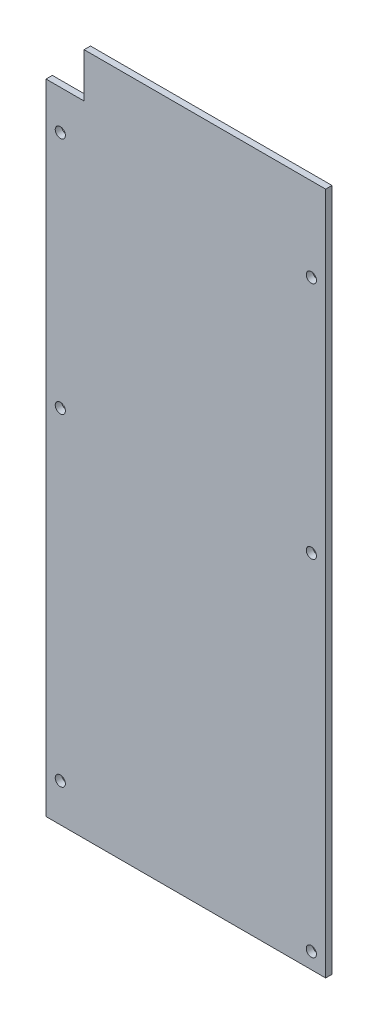
ISO-10303-21;
HEADER;
FILE_DESCRIPTION(('STEP AP214'),'2;1');
FILE_NAME('part.step','',(''),(''),'','','');
FILE_SCHEMA(('AUTOMOTIVE_DESIGN { 1 0 10303 214 1 1 1 1 }'));
ENDSEC;
DATA;
#1=APPLICATION_CONTEXT('core data for automotive mechanical design processes');
#2=APPLICATION_PROTOCOL_DEFINITION('international standard','automotive_design',2000,#1);
#3=PRODUCT_CONTEXT('',#1,'mechanical');
#4=PRODUCT('Part','Part','',(#3));
#5=PRODUCT_RELATED_PRODUCT_CATEGORY('part','',(#4));
#6=PRODUCT_DEFINITION_FORMATION('','',#4);
#7=PRODUCT_DEFINITION_CONTEXT('part definition',#1,'design');
#8=PRODUCT_DEFINITION('design','',#6,#7);
#9=PRODUCT_DEFINITION_SHAPE('','',#8);
#10=(LENGTH_UNIT() NAMED_UNIT(*) SI_UNIT(.MILLI.,.METRE.));
#11=(NAMED_UNIT(*) PLANE_ANGLE_UNIT() SI_UNIT($,.RADIAN.));
#12=(NAMED_UNIT(*) SI_UNIT($,.STERADIAN.) SOLID_ANGLE_UNIT());
#13=UNCERTAINTY_MEASURE_WITH_UNIT(LENGTH_MEASURE(1.E-05),#10,'distance_accuracy_value','');
#14=(GEOMETRIC_REPRESENTATION_CONTEXT(3) GLOBAL_UNCERTAINTY_ASSIGNED_CONTEXT((#13)) GLOBAL_UNIT_ASSIGNED_CONTEXT((#10,
#11,#12)) REPRESENTATION_CONTEXT('',''));
#15=CARTESIAN_POINT('',(0.,0.,0.));
#16=DIRECTION('',(0.,0.,1.));
#17=DIRECTION('',(1.,0.,0.));
#18=AXIS2_PLACEMENT_3D('',#15,#16,#17);
#19=CARTESIAN_POINT('',(0.,215.,2.));
#20=DIRECTION('',(0.,1.,0.));
#21=DIRECTION('',(0.,0.,1.));
#22=AXIS2_PLACEMENT_3D('',#19,#20,#21);
#23=PLANE('',#22);
#24=DIRECTION('',(1.,0.,0.));
#25=VECTOR('',#24,1.);
#26=CARTESIAN_POINT('',(0.,215.,0.));
#27=LINE('',#26,#25);
#28=CARTESIAN_POINT('',(12.,215.,0.));
#29=VERTEX_POINT('',#28);
#30=CARTESIAN_POINT('',(88.,215.,0.));
#31=VERTEX_POINT('',#30);
#32=EDGE_CURVE('E141',#29,#31,#27,.T.);
#33=ORIENTED_EDGE('',*,*,#32,.F.);
#34=DIRECTION('',(0.,0.,-1.));
#35=VECTOR('',#34,1.);
#36=CARTESIAN_POINT('',(12.,215.,2.));
#37=LINE('',#36,#35);
#38=CARTESIAN_POINT('',(12.,215.,2.));
#39=VERTEX_POINT('',#38);
#40=EDGE_CURVE('E11',#39,#29,#37,.T.);
#41=ORIENTED_EDGE('',*,*,#40,.F.);
#42=DIRECTION('',(1.,0.,0.));
#43=VECTOR('',#42,1.);
#44=CARTESIAN_POINT('',(0.,215.,2.));
#45=LINE('',#44,#43);
#46=CARTESIAN_POINT('',(88.,215.,2.));
#47=VERTEX_POINT('',#46);
#48=EDGE_CURVE('E240',#39,#47,#45,.T.);
#49=ORIENTED_EDGE('',*,*,#48,.T.);
#50=DIRECTION('',(0.,0.,-1.));
#51=VECTOR('',#50,1.);
#52=CARTESIAN_POINT('',(88.,215.,2.));
#53=LINE('',#52,#51);
#54=EDGE_CURVE('E82',#47,#31,#53,.T.);
#55=ORIENTED_EDGE('',*,*,#54,.T.);
#56=EDGE_LOOP('',(#33,#41,#49,#55));
#57=FACE_BOUND('',#56,.T.);
#58=ADVANCED_FACE('F36',(#57),#23,.T.);
#59=CARTESIAN_POINT('',(12.0000000000001,0.,2.));
#60=DIRECTION('',(1.,0.,0.));
#61=DIRECTION('',(0.,1.,0.));
#62=AXIS2_PLACEMENT_3D('',#59,#60,#61);
#63=PLANE('',#62);
#64=DIRECTION('',(0.,-1.,0.));
#65=VECTOR('',#64,1.);
#66=CARTESIAN_POINT('',(12.0000000000001,0.,0.));
#67=LINE('',#66,#65);
#68=CARTESIAN_POINT('',(12.,201.,0.));
#69=VERTEX_POINT('',#68);
#70=EDGE_CURVE('E143',#29,#69,#67,.T.);
#71=ORIENTED_EDGE('',*,*,#70,.T.);
#72=DIRECTION('',(0.,0.,-1.));
#73=VECTOR('',#72,1.);
#74=CARTESIAN_POINT('',(12.,201.,2.));
#75=LINE('',#74,#73);
#76=CARTESIAN_POINT('',(12.,201.,2.));
#77=VERTEX_POINT('',#76);
#78=EDGE_CURVE('E45',#77,#69,#75,.T.);
#79=ORIENTED_EDGE('',*,*,#78,.F.);
#80=DIRECTION('',(0.,-1.,0.));
#81=VECTOR('',#80,1.);
#82=CARTESIAN_POINT('',(12.0000000000001,0.,2.));
#83=LINE('',#82,#81);
#84=EDGE_CURVE('E118',#39,#77,#83,.T.);
#85=ORIENTED_EDGE('',*,*,#84,.F.);
#86=ORIENTED_EDGE('',*,*,#40,.T.);
#87=EDGE_LOOP('',(#71,#79,#85,#86));
#88=FACE_BOUND('',#87,.T.);
#89=ADVANCED_FACE('F165',(#88),#63,.F.);
#90=CARTESIAN_POINT('',(0.,201.,2.));
#91=DIRECTION('',(0.,1.,0.));
#92=DIRECTION('',(0.,0.,1.));
#93=AXIS2_PLACEMENT_3D('',#90,#91,#92);
#94=PLANE('',#93);
#95=DIRECTION('',(1.,0.,0.));
#96=VECTOR('',#95,1.);
#97=CARTESIAN_POINT('',(0.,201.,0.));
#98=LINE('',#97,#96);
#99=CARTESIAN_POINT('',(0.,201.,0.));
#100=VERTEX_POINT('',#99);
#101=EDGE_CURVE('E146',#100,#69,#98,.T.);
#102=ORIENTED_EDGE('',*,*,#101,.F.);
#103=DIRECTION('',(0.,0.,-1.));
#104=VECTOR('',#103,1.);
#105=CARTESIAN_POINT('',(0.,201.,2.));
#106=LINE('',#105,#104);
#107=CARTESIAN_POINT('',(0.,201.,2.));
#108=VERTEX_POINT('',#107);
#109=EDGE_CURVE('E105',#108,#100,#106,.T.);
#110=ORIENTED_EDGE('',*,*,#109,.F.);
#111=DIRECTION('',(1.,0.,0.));
#112=VECTOR('',#111,1.);
#113=CARTESIAN_POINT('',(0.,201.,2.));
#114=LINE('',#113,#112);
#115=EDGE_CURVE('E116',#108,#77,#114,.T.);
#116=ORIENTED_EDGE('',*,*,#115,.T.);
#117=ORIENTED_EDGE('',*,*,#78,.T.);
#118=EDGE_LOOP('',(#102,#110,#116,#117));
#119=FACE_BOUND('',#118,.T.);
#120=ADVANCED_FACE('F162',(#119),#94,.T.);
#121=CARTESIAN_POINT('',(0.,0.,2.));
#122=DIRECTION('',(-1.,0.,0.));
#123=DIRECTION('',(0.,0.,1.));
#124=AXIS2_PLACEMENT_3D('',#121,#122,#123);
#125=PLANE('',#124);
#126=DIRECTION('',(0.,1.,0.));
#127=VECTOR('',#126,1.);
#128=CARTESIAN_POINT('',(0.,0.,0.));
#129=LINE('',#128,#127);
#130=CARTESIAN_POINT('',(0.,0.,0.));
#131=VERTEX_POINT('',#130);
#132=EDGE_CURVE('E102',#131,#100,#129,.T.);
#133=ORIENTED_EDGE('',*,*,#132,.F.);
#134=DIRECTION('',(0.,0.,-1.));
#135=VECTOR('',#134,1.);
#136=CARTESIAN_POINT('',(0.,0.,2.));
#137=LINE('',#136,#135);
#138=CARTESIAN_POINT('',(0.,0.,2.));
#139=VERTEX_POINT('',#138);
#140=EDGE_CURVE('E96',#139,#131,#137,.T.);
#141=ORIENTED_EDGE('',*,*,#140,.F.);
#142=DIRECTION('',(0.,1.,0.));
#143=VECTOR('',#142,1.);
#144=CARTESIAN_POINT('',(0.,0.,2.));
#145=LINE('',#144,#143);
#146=EDGE_CURVE('E100',#139,#108,#145,.T.);
#147=ORIENTED_EDGE('',*,*,#146,.T.);
#148=ORIENTED_EDGE('',*,*,#109,.T.);
#149=EDGE_LOOP('',(#133,#141,#147,#148));
#150=FACE_BOUND('',#149,.T.);
#151=ADVANCED_FACE('F98',(#150),#125,.T.);
#152=CARTESIAN_POINT('',(0.,0.,2.));
#153=DIRECTION('',(0.,1.,0.));
#154=DIRECTION('',(0.,0.,1.));
#155=AXIS2_PLACEMENT_3D('',#152,#153,#154);
#156=PLANE('',#155);
#157=DIRECTION('',(1.,0.,0.));
#158=VECTOR('',#157,1.);
#159=CARTESIAN_POINT('',(0.,0.,0.));
#160=LINE('',#159,#158);
#161=CARTESIAN_POINT('',(88.,0.,0.));
#162=VERTEX_POINT('',#161);
#163=EDGE_CURVE('E150',#131,#162,#160,.T.);
#164=ORIENTED_EDGE('',*,*,#163,.T.);
#165=DIRECTION('',(0.,0.,-1.));
#166=VECTOR('',#165,1.);
#167=CARTESIAN_POINT('',(88.,0.,2.));
#168=LINE('',#167,#166);
#169=CARTESIAN_POINT('',(88.,0.,2.));
#170=VERTEX_POINT('',#169);
#171=EDGE_CURVE('E106',#170,#162,#168,.T.);
#172=ORIENTED_EDGE('',*,*,#171,.F.);
#173=DIRECTION('',(1.,0.,0.));
#174=VECTOR('',#173,1.);
#175=CARTESIAN_POINT('',(0.,0.,2.));
#176=LINE('',#175,#174);
#177=EDGE_CURVE('E109',#139,#170,#176,.T.);
#178=ORIENTED_EDGE('',*,*,#177,.F.);
#179=ORIENTED_EDGE('',*,*,#140,.T.);
#180=EDGE_LOOP('',(#164,#172,#178,#179));
#181=FACE_BOUND('',#180,.T.);
#182=ADVANCED_FACE('F110',(#181),#156,.F.);
#183=CARTESIAN_POINT('',(88.,0.,2.));
#184=DIRECTION('',(-1.,0.,0.));
#185=DIRECTION('',(0.,0.,1.));
#186=AXIS2_PLACEMENT_3D('',#183,#184,#185);
#187=PLANE('',#186);
#188=DIRECTION('',(0.,1.,0.));
#189=VECTOR('',#188,1.);
#190=CARTESIAN_POINT('',(88.,0.,0.));
#191=LINE('',#190,#189);
#192=EDGE_CURVE('E75',#162,#31,#191,.T.);
#193=ORIENTED_EDGE('',*,*,#192,.T.);
#194=ORIENTED_EDGE('',*,*,#54,.F.);
#195=DIRECTION('',(0.,1.,0.));
#196=VECTOR('',#195,1.);
#197=CARTESIAN_POINT('',(88.,0.,2.));
#198=LINE('',#197,#196);
#199=EDGE_CURVE('E53',#170,#47,#198,.T.);
#200=ORIENTED_EDGE('',*,*,#199,.F.);
#201=ORIENTED_EDGE('',*,*,#171,.T.);
#202=EDGE_LOOP('',(#193,#194,#200,#201));
#203=FACE_BOUND('',#202,.T.);
#204=ADVANCED_FACE('F199',(#203),#187,.F.);
#205=CARTESIAN_POINT('',(4.5,12.,2.));
#206=DIRECTION('',(0.,0.,-1.));
#207=DIRECTION('',(-1.,0.,0.));
#208=AXIS2_PLACEMENT_3D('',#205,#206,#207);
#209=CYLINDRICAL_SURFACE('',#208,1.6);
#210=CARTESIAN_POINT('',(4.5,12.,2.));
#211=DIRECTION('',(0.,0.,1.));
#212=DIRECTION('',(1.,0.,0.));
#213=AXIS2_PLACEMENT_3D('',#210,#211,#212);
#214=CIRCLE('',#213,1.6);
#215=CARTESIAN_POINT('',(6.1,12.,2.));
#216=VERTEX_POINT('',#215);
#217=EDGE_CURVE('E237',#216,#216,#214,.T.);
#218=ORIENTED_EDGE('',*,*,#217,.T.);
#219=EDGE_LOOP('',(#218));
#220=FACE_BOUND('',#219,.T.);
#221=CARTESIAN_POINT('',(4.5,12.,0.));
#222=DIRECTION('',(0.,0.,1.));
#223=DIRECTION('',(1.,0.,0.));
#224=AXIS2_PLACEMENT_3D('',#221,#222,#223);
#225=CIRCLE('',#224,1.6);
#226=CARTESIAN_POINT('',(6.1,12.,0.));
#227=VERTEX_POINT('',#226);
#228=EDGE_CURVE('E138',#227,#227,#225,.T.);
#229=ORIENTED_EDGE('',*,*,#228,.F.);
#230=EDGE_LOOP('',(#229));
#231=FACE_BOUND('',#230,.T.);
#232=ADVANCED_FACE('F195',(#220,#231),#209,.F.);
#233=CARTESIAN_POINT('',(4.5,113.59,2.));
#234=DIRECTION('',(0.,0.,-1.));
#235=DIRECTION('',(-1.,0.,0.));
#236=AXIS2_PLACEMENT_3D('',#233,#234,#235);
#237=CYLINDRICAL_SURFACE('',#236,1.60000000000001);
#238=CARTESIAN_POINT('',(4.5,113.59,2.));
#239=DIRECTION('',(0.,0.,1.));
#240=DIRECTION('',(1.,0.,0.));
#241=AXIS2_PLACEMENT_3D('',#238,#239,#240);
#242=CIRCLE('',#241,1.60000000000001);
#243=CARTESIAN_POINT('',(6.10000000000001,113.59,2.));
#244=VERTEX_POINT('',#243);
#245=EDGE_CURVE('E230',#244,#244,#242,.T.);
#246=ORIENTED_EDGE('',*,*,#245,.T.);
#247=EDGE_LOOP('',(#246));
#248=FACE_BOUND('',#247,.T.);
#249=CARTESIAN_POINT('',(4.5,113.59,0.));
#250=DIRECTION('',(0.,0.,1.));
#251=DIRECTION('',(1.,0.,0.));
#252=AXIS2_PLACEMENT_3D('',#249,#250,#251);
#253=CIRCLE('',#252,1.60000000000001);
#254=CARTESIAN_POINT('',(6.10000000000001,113.59,0.));
#255=VERTEX_POINT('',#254);
#256=EDGE_CURVE('E135',#255,#255,#253,.T.);
#257=ORIENTED_EDGE('',*,*,#256,.F.);
#258=EDGE_LOOP('',(#257));
#259=FACE_BOUND('',#258,.T.);
#260=ADVANCED_FACE('F198',(#248,#259),#237,.F.);
#261=CARTESIAN_POINT('',(4.5,188.68,2.));
#262=DIRECTION('',(0.,0.,-1.));
#263=DIRECTION('',(-1.,0.,0.));
#264=AXIS2_PLACEMENT_3D('',#261,#262,#263);
#265=CYLINDRICAL_SURFACE('',#264,1.59999999999999);
#266=CARTESIAN_POINT('',(4.5,188.68,2.));
#267=DIRECTION('',(0.,0.,1.));
#268=DIRECTION('',(1.,0.,0.));
#269=AXIS2_PLACEMENT_3D('',#266,#267,#268);
#270=CIRCLE('',#269,1.59999999999999);
#271=CARTESIAN_POINT('',(6.09999999999999,188.68,2.));
#272=VERTEX_POINT('',#271);
#273=EDGE_CURVE('E227',#272,#272,#270,.T.);
#274=ORIENTED_EDGE('',*,*,#273,.T.);
#275=EDGE_LOOP('',(#274));
#276=FACE_BOUND('',#275,.T.);
#277=CARTESIAN_POINT('',(4.5,188.68,0.));
#278=DIRECTION('',(0.,0.,1.));
#279=DIRECTION('',(1.,0.,0.));
#280=AXIS2_PLACEMENT_3D('',#277,#278,#279);
#281=CIRCLE('',#280,1.59999999999999);
#282=CARTESIAN_POINT('',(6.09999999999999,188.68,0.));
#283=VERTEX_POINT('',#282);
#284=EDGE_CURVE('E132',#283,#283,#281,.T.);
#285=ORIENTED_EDGE('',*,*,#284,.F.);
#286=EDGE_LOOP('',(#285));
#287=FACE_BOUND('',#286,.T.);
#288=ADVANCED_FACE('F203',(#276,#287),#265,.F.);
#289=CARTESIAN_POINT('',(83.5,188.68,2.));
#290=DIRECTION('',(0.,0.,-1.));
#291=DIRECTION('',(-1.,0.,0.));
#292=AXIS2_PLACEMENT_3D('',#289,#290,#291);
#293=CYLINDRICAL_SURFACE('',#292,1.6);
#294=CARTESIAN_POINT('',(83.5,188.68,2.));
#295=DIRECTION('',(0.,0.,1.));
#296=DIRECTION('',(1.,0.,0.));
#297=AXIS2_PLACEMENT_3D('',#294,#295,#296);
#298=CIRCLE('',#297,1.6);
#299=CARTESIAN_POINT('',(85.1,188.68,2.));
#300=VERTEX_POINT('',#299);
#301=EDGE_CURVE('E214',#300,#300,#298,.F.);
#302=ORIENTED_EDGE('',*,*,#301,.F.);
#303=EDGE_LOOP('',(#302));
#304=FACE_BOUND('',#303,.T.);
#305=CARTESIAN_POINT('',(83.5,188.68,0.));
#306=DIRECTION('',(0.,0.,1.));
#307=DIRECTION('',(1.,0.,0.));
#308=AXIS2_PLACEMENT_3D('',#305,#306,#307);
#309=CIRCLE('',#308,1.6);
#310=CARTESIAN_POINT('',(85.1,188.68,0.));
#311=VERTEX_POINT('',#310);
#312=EDGE_CURVE('E129',#311,#311,#309,.F.);
#313=ORIENTED_EDGE('',*,*,#312,.T.);
#314=EDGE_LOOP('',(#313));
#315=FACE_BOUND('',#314,.T.);
#316=ADVANCED_FACE('F183',(#304,#315),#293,.F.);
#317=CARTESIAN_POINT('',(83.5,5.,2.));
#318=DIRECTION('',(0.,0.,-1.));
#319=DIRECTION('',(-1.,0.,0.));
#320=AXIS2_PLACEMENT_3D('',#317,#318,#319);
#321=CYLINDRICAL_SURFACE('',#320,1.60000000000001);
#322=CARTESIAN_POINT('',(83.5,5.,2.));
#323=DIRECTION('',(0.,0.,1.));
#324=DIRECTION('',(1.,0.,0.));
#325=AXIS2_PLACEMENT_3D('',#322,#323,#324);
#326=CIRCLE('',#325,1.60000000000001);
#327=CARTESIAN_POINT('',(85.1,5.,2.));
#328=VERTEX_POINT('',#327);
#329=EDGE_CURVE('E156',#328,#328,#326,.T.);
#330=ORIENTED_EDGE('',*,*,#329,.T.);
#331=EDGE_LOOP('',(#330));
#332=FACE_BOUND('',#331,.T.);
#333=CARTESIAN_POINT('',(83.5,5.,0.));
#334=DIRECTION('',(0.,0.,1.));
#335=DIRECTION('',(1.,0.,0.));
#336=AXIS2_PLACEMENT_3D('',#333,#334,#335);
#337=CIRCLE('',#336,1.60000000000001);
#338=CARTESIAN_POINT('',(85.1,5.,0.));
#339=VERTEX_POINT('',#338);
#340=EDGE_CURVE('E126',#339,#339,#337,.T.);
#341=ORIENTED_EDGE('',*,*,#340,.F.);
#342=EDGE_LOOP('',(#341));
#343=FACE_BOUND('',#342,.T.);
#344=ADVANCED_FACE('F38',(#332,#343),#321,.F.);
#345=CARTESIAN_POINT('',(83.5,113.59,2.));
#346=DIRECTION('',(0.,0.,-1.));
#347=DIRECTION('',(-1.,0.,0.));
#348=AXIS2_PLACEMENT_3D('',#345,#346,#347);
#349=CYLINDRICAL_SURFACE('',#348,1.60000000000001);
#350=CARTESIAN_POINT('',(83.5,113.59,2.));
#351=DIRECTION('',(0.,0.,1.));
#352=DIRECTION('',(1.,0.,0.));
#353=AXIS2_PLACEMENT_3D('',#350,#351,#352);
#354=CIRCLE('',#353,1.60000000000001);
#355=CARTESIAN_POINT('',(85.1,113.59,2.));
#356=VERTEX_POINT('',#355);
#357=EDGE_CURVE('E123',#356,#356,#354,.F.);
#358=ORIENTED_EDGE('',*,*,#357,.F.);
#359=EDGE_LOOP('',(#358));
#360=FACE_BOUND('',#359,.T.);
#361=CARTESIAN_POINT('',(83.5,113.59,0.));
#362=DIRECTION('',(0.,0.,1.));
#363=DIRECTION('',(1.,0.,0.));
#364=AXIS2_PLACEMENT_3D('',#361,#362,#363);
#365=CIRCLE('',#364,1.60000000000001);
#366=CARTESIAN_POINT('',(85.1,113.59,0.));
#367=VERTEX_POINT('',#366);
#368=EDGE_CURVE('E153',#367,#367,#365,.F.);
#369=ORIENTED_EDGE('',*,*,#368,.T.);
#370=EDGE_LOOP('',(#369));
#371=FACE_BOUND('',#370,.T.);
#372=ADVANCED_FACE('F173',(#360,#371),#349,.F.);
#373=CARTESIAN_POINT('',(0.,0.,2.));
#374=DIRECTION('',(0.,0.,1.));
#375=DIRECTION('',(1.,0.,0.));
#376=AXIS2_PLACEMENT_3D('',#373,#374,#375);
#377=PLANE('',#376);
#378=ORIENTED_EDGE('',*,*,#329,.F.);
#379=EDGE_LOOP('',(#378));
#380=FACE_BOUND('',#379,.T.);
#381=ORIENTED_EDGE('',*,*,#301,.T.);
#382=EDGE_LOOP('',(#381));
#383=FACE_BOUND('',#382,.T.);
#384=ORIENTED_EDGE('',*,*,#273,.F.);
#385=EDGE_LOOP('',(#384));
#386=FACE_BOUND('',#385,.T.);
#387=ORIENTED_EDGE('',*,*,#245,.F.);
#388=EDGE_LOOP('',(#387));
#389=FACE_BOUND('',#388,.T.);
#390=ORIENTED_EDGE('',*,*,#217,.F.);
#391=EDGE_LOOP('',(#390));
#392=FACE_BOUND('',#391,.T.);
#393=ORIENTED_EDGE('',*,*,#48,.F.);
#394=ORIENTED_EDGE('',*,*,#84,.T.);
#395=ORIENTED_EDGE('',*,*,#115,.F.);
#396=ORIENTED_EDGE('',*,*,#146,.F.);
#397=ORIENTED_EDGE('',*,*,#177,.T.);
#398=ORIENTED_EDGE('',*,*,#199,.T.);
#399=EDGE_LOOP('',(#393,#394,#395,#396,#397,#398));
#400=FACE_BOUND('',#399,.T.);
#401=ORIENTED_EDGE('',*,*,#357,.T.);
#402=EDGE_LOOP('',(#401));
#403=FACE_BOUND('',#402,.T.);
#404=ADVANCED_FACE('F113',(#380,#383,#386,#389,#392,#400,#403),#377,.T.);
#405=CARTESIAN_POINT('',(0.,0.,0.));
#406=DIRECTION('',(0.,0.,1.));
#407=DIRECTION('',(1.,0.,0.));
#408=AXIS2_PLACEMENT_3D('',#405,#406,#407);
#409=PLANE('',#408);
#410=ORIENTED_EDGE('',*,*,#340,.T.);
#411=EDGE_LOOP('',(#410));
#412=FACE_BOUND('',#411,.T.);
#413=ORIENTED_EDGE('',*,*,#312,.F.);
#414=EDGE_LOOP('',(#413));
#415=FACE_BOUND('',#414,.T.);
#416=ORIENTED_EDGE('',*,*,#284,.T.);
#417=EDGE_LOOP('',(#416));
#418=FACE_BOUND('',#417,.T.);
#419=ORIENTED_EDGE('',*,*,#256,.T.);
#420=EDGE_LOOP('',(#419));
#421=FACE_BOUND('',#420,.T.);
#422=ORIENTED_EDGE('',*,*,#228,.T.);
#423=EDGE_LOOP('',(#422));
#424=FACE_BOUND('',#423,.T.);
#425=ORIENTED_EDGE('',*,*,#32,.T.);
#426=ORIENTED_EDGE('',*,*,#192,.F.);
#427=ORIENTED_EDGE('',*,*,#163,.F.);
#428=ORIENTED_EDGE('',*,*,#132,.T.);
#429=ORIENTED_EDGE('',*,*,#101,.T.);
#430=ORIENTED_EDGE('',*,*,#70,.F.);
#431=EDGE_LOOP('',(#425,#426,#427,#428,#429,#430));
#432=FACE_BOUND('',#431,.T.);
#433=ORIENTED_EDGE('',*,*,#368,.F.);
#434=EDGE_LOOP('',(#433));
#435=FACE_BOUND('',#434,.T.);
#436=ADVANCED_FACE('F166',(#412,#415,#418,#421,#424,#432,#435),#409,.F.);
#437=CLOSED_SHELL('',(#58,#89,#120,#151,#182,#204,#232,#260,#288,#316,#344,#372,#404,#436));
#438=MANIFOLD_SOLID_BREP('B2',#437);
#439=ADVANCED_BREP_SHAPE_REPRESENTATION('',(#18,#438),#14);
#440=SHAPE_DEFINITION_REPRESENTATION(#9,#439);
ENDSEC;
END-ISO-10303-21;
